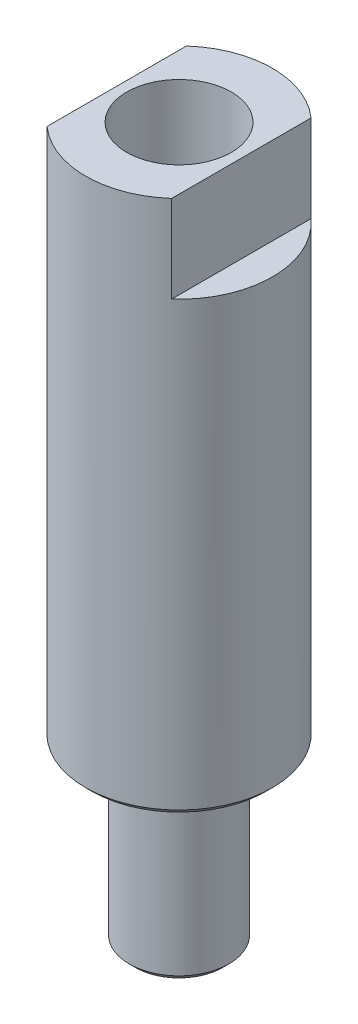
ISO-10303-21;
HEADER;
FILE_DESCRIPTION(('STEP AP214'),'2;1');
FILE_NAME('part.step','',(''),(''),'','','');
FILE_SCHEMA(('AUTOMOTIVE_DESIGN { 1 0 10303 214 1 1 1 1 }'));
ENDSEC;
DATA;
#1=APPLICATION_CONTEXT('core data for automotive mechanical design processes');
#2=APPLICATION_PROTOCOL_DEFINITION('international standard','automotive_design',2000,#1);
#3=PRODUCT_CONTEXT('',#1,'mechanical');
#4=PRODUCT('Part','Part','',(#3));
#5=PRODUCT_RELATED_PRODUCT_CATEGORY('part','',(#4));
#6=PRODUCT_DEFINITION_FORMATION('','',#4);
#7=PRODUCT_DEFINITION_CONTEXT('part definition',#1,'design');
#8=PRODUCT_DEFINITION('design','',#6,#7);
#9=PRODUCT_DEFINITION_SHAPE('','',#8);
#10=(LENGTH_UNIT() NAMED_UNIT(*) SI_UNIT(.MILLI.,.METRE.));
#11=(NAMED_UNIT(*) PLANE_ANGLE_UNIT() SI_UNIT($,.RADIAN.));
#12=(NAMED_UNIT(*) SI_UNIT($,.STERADIAN.) SOLID_ANGLE_UNIT());
#13=UNCERTAINTY_MEASURE_WITH_UNIT(LENGTH_MEASURE(1.E-05),#10,'distance_accuracy_value','');
#14=(GEOMETRIC_REPRESENTATION_CONTEXT(3) GLOBAL_UNCERTAINTY_ASSIGNED_CONTEXT((#13)) GLOBAL_UNIT_ASSIGNED_CONTEXT((#10,
#11,#12)) REPRESENTATION_CONTEXT('',''));
#15=CARTESIAN_POINT('',(0.,0.,0.));
#16=DIRECTION('',(0.,0.,1.));
#17=DIRECTION('',(1.,0.,0.));
#18=AXIS2_PLACEMENT_3D('',#15,#16,#17);
#19=CARTESIAN_POINT('',(0.,43.,0.));
#20=DIRECTION('',(0.,1.,0.));
#21=DIRECTION('',(0.,0.,1.));
#22=AXIS2_PLACEMENT_3D('',#19,#20,#21);
#23=PLANE('',#22);
#24=DIRECTION('',(0.,0.,-1.));
#25=VECTOR('',#24,1.);
#26=CARTESIAN_POINT('',(-5.,43.,0.));
#27=LINE('',#26,#25);
#28=CARTESIAN_POINT('',(-5.,43.,5.59016994374947));
#29=VERTEX_POINT('',#28);
#30=CARTESIAN_POINT('',(-5.,43.,-5.59016994374947));
#31=VERTEX_POINT('',#30);
#32=EDGE_CURVE('E92',#29,#31,#27,.T.);
#33=ORIENTED_EDGE('',*,*,#32,.F.);
#34=CARTESIAN_POINT('',(0.,43.,0.));
#35=DIRECTION('',(0.,1.,0.));
#36=DIRECTION('',(0.,0.,1.));
#37=AXIS2_PLACEMENT_3D('',#34,#35,#36);
#38=CIRCLE('',#37,7.5);
#39=CARTESIAN_POINT('',(5.,43.,5.59016994374947));
#40=VERTEX_POINT('',#39);
#41=EDGE_CURVE('E117',#29,#40,#38,.T.);
#42=ORIENTED_EDGE('',*,*,#41,.T.);
#43=DIRECTION('',(0.,0.,-1.));
#44=VECTOR('',#43,1.);
#45=CARTESIAN_POINT('',(5.,43.,0.));
#46=LINE('',#45,#44);
#47=CARTESIAN_POINT('',(5.,43.,-5.59016994374947));
#48=VERTEX_POINT('',#47);
#49=EDGE_CURVE('E107',#40,#48,#46,.T.);
#50=ORIENTED_EDGE('',*,*,#49,.T.);
#51=EDGE_CURVE('E120',#48,#31,#38,.T.);
#52=ORIENTED_EDGE('',*,*,#51,.T.);
#53=EDGE_LOOP('',(#33,#42,#50,#52));
#54=FACE_BOUND('',#53,.T.);
#55=CARTESIAN_POINT('',(0.,43.,0.));
#56=DIRECTION('',(0.,-1.,0.));
#57=DIRECTION('',(0.,0.,-1.));
#58=AXIS2_PLACEMENT_3D('',#55,#56,#57);
#59=CIRCLE('',#58,4.2);
#60=CARTESIAN_POINT('',(0.,43.,-4.2));
#61=VERTEX_POINT('',#60);
#62=EDGE_CURVE('E93',#61,#61,#59,.T.);
#63=ORIENTED_EDGE('',*,*,#62,.T.);
#64=EDGE_LOOP('',(#63));
#65=FACE_BOUND('',#64,.T.);
#66=ADVANCED_FACE('F38',(#54,#65),#23,.T.);
#67=CARTESIAN_POINT('',(0.,43.,0.));
#68=DIRECTION('',(0.,-1.,0.));
#69=DIRECTION('',(0.,0.,-1.));
#70=AXIS2_PLACEMENT_3D('',#67,#68,#69);
#71=CYLINDRICAL_SURFACE('',#70,7.5);
#72=CARTESIAN_POINT('',(0.,0.5,0.));
#73=DIRECTION('',(0.,1.,0.));
#74=DIRECTION('',(0.,0.,1.));
#75=AXIS2_PLACEMENT_3D('',#72,#73,#74);
#76=CIRCLE('',#75,7.5);
#77=CARTESIAN_POINT('',(0.,0.5,7.5));
#78=VERTEX_POINT('',#77);
#79=EDGE_CURVE('E46',#78,#78,#76,.T.);
#80=ORIENTED_EDGE('',*,*,#79,.T.);
#81=EDGE_LOOP('',(#80));
#82=FACE_BOUND('',#81,.T.);
#83=ORIENTED_EDGE('',*,*,#41,.F.);
#84=DIRECTION('',(0.,1.,0.));
#85=VECTOR('',#84,1.);
#86=CARTESIAN_POINT('',(-5.,36.,5.59016994374947));
#87=LINE('',#86,#85);
#88=CARTESIAN_POINT('',(-5.,36.,5.59016994374947));
#89=VERTEX_POINT('',#88);
#90=EDGE_CURVE('E53',#89,#29,#87,.T.);
#91=ORIENTED_EDGE('',*,*,#90,.F.);
#92=CARTESIAN_POINT('',(0.,36.,0.));
#93=DIRECTION('',(0.,1.,0.));
#94=DIRECTION('',(0.,0.,1.));
#95=AXIS2_PLACEMENT_3D('',#92,#93,#94);
#96=CIRCLE('',#95,7.5);
#97=CARTESIAN_POINT('',(-5.,36.,-5.59016994374947));
#98=VERTEX_POINT('',#97);
#99=EDGE_CURVE('E95',#98,#89,#96,.T.);
#100=ORIENTED_EDGE('',*,*,#99,.F.);
#101=DIRECTION('',(0.,1.,0.));
#102=VECTOR('',#101,1.);
#103=CARTESIAN_POINT('',(-5.,36.,-5.59016994374947));
#104=LINE('',#103,#102);
#105=EDGE_CURVE('E104',#98,#31,#104,.T.);
#106=ORIENTED_EDGE('',*,*,#105,.T.);
#107=ORIENTED_EDGE('',*,*,#51,.F.);
#108=DIRECTION('',(0.,1.,0.));
#109=VECTOR('',#108,1.);
#110=CARTESIAN_POINT('',(5.,36.,-5.59016994374947));
#111=LINE('',#110,#109);
#112=CARTESIAN_POINT('',(5.,36.,-5.59016994374947));
#113=VERTEX_POINT('',#112);
#114=EDGE_CURVE('E61',#113,#48,#111,.T.);
#115=ORIENTED_EDGE('',*,*,#114,.F.);
#116=CARTESIAN_POINT('',(0.,36.,0.));
#117=DIRECTION('',(0.,1.,0.));
#118=DIRECTION('',(0.,0.,1.));
#119=AXIS2_PLACEMENT_3D('',#116,#117,#118);
#120=CIRCLE('',#119,7.5);
#121=CARTESIAN_POINT('',(5.,36.,5.59016994374947));
#122=VERTEX_POINT('',#121);
#123=EDGE_CURVE('E112',#122,#113,#120,.T.);
#124=ORIENTED_EDGE('',*,*,#123,.F.);
#125=DIRECTION('',(0.,1.,0.));
#126=VECTOR('',#125,1.);
#127=CARTESIAN_POINT('',(5.,36.,5.59016994374947));
#128=LINE('',#127,#126);
#129=EDGE_CURVE('E115',#122,#40,#128,.T.);
#130=ORIENTED_EDGE('',*,*,#129,.T.);
#131=EDGE_LOOP('',(#83,#91,#100,#106,#107,#115,#124,#130));
#132=FACE_BOUND('',#131,.T.);
#133=ADVANCED_FACE('F40',(#82,#132),#71,.T.);
#134=CARTESIAN_POINT('',(0.,0.,0.));
#135=DIRECTION('',(0.,1.,0.));
#136=DIRECTION('',(0.,0.,1.));
#137=AXIS2_PLACEMENT_3D('',#134,#135,#136);
#138=PLANE('',#137);
#139=CARTESIAN_POINT('',(0.,0.,0.));
#140=DIRECTION('',(0.,1.,0.));
#141=DIRECTION('',(0.,0.,1.));
#142=AXIS2_PLACEMENT_3D('',#139,#140,#141);
#143=CIRCLE('',#142,6.99999999999999);
#144=CARTESIAN_POINT('',(0.,0.,6.99999999999999));
#145=VERTEX_POINT('',#144);
#146=EDGE_CURVE('E11',#145,#145,#143,.F.);
#147=ORIENTED_EDGE('',*,*,#146,.T.);
#148=EDGE_LOOP('',(#147));
#149=FACE_BOUND('',#148,.T.);
#150=CARTESIAN_POINT('',(0.,0.,0.));
#151=DIRECTION('',(0.,1.,0.));
#152=DIRECTION('',(0.,0.,1.));
#153=AXIS2_PLACEMENT_3D('',#150,#151,#152);
#154=CIRCLE('',#153,4.);
#155=CARTESIAN_POINT('',(0.,0.,4.));
#156=VERTEX_POINT('',#155);
#157=EDGE_CURVE('E123',#156,#156,#154,.F.);
#158=ORIENTED_EDGE('',*,*,#157,.F.);
#159=EDGE_LOOP('',(#158));
#160=FACE_BOUND('',#159,.T.);
#161=ADVANCED_FACE('F152',(#149,#160),#138,.F.);
#162=CARTESIAN_POINT('',(0.,-14.,0.));
#163=DIRECTION('',(0.,1.,0.));
#164=DIRECTION('',(0.,0.,1.));
#165=AXIS2_PLACEMENT_3D('',#162,#163,#164);
#166=CYLINDRICAL_SURFACE('',#165,4.);
#167=CARTESIAN_POINT('',(0.,-13.5,0.));
#168=DIRECTION('',(0.,-1.,0.));
#169=DIRECTION('',(0.,0.,-1.));
#170=AXIS2_PLACEMENT_3D('',#167,#168,#169);
#171=CIRCLE('',#170,4.);
#172=CARTESIAN_POINT('',(0.,-13.5,-4.));
#173=VERTEX_POINT('',#172);
#174=EDGE_CURVE('E129',#173,#173,#171,.F.);
#175=ORIENTED_EDGE('',*,*,#174,.T.);
#176=EDGE_LOOP('',(#175));
#177=FACE_BOUND('',#176,.T.);
#178=ORIENTED_EDGE('',*,*,#157,.T.);
#179=EDGE_LOOP('',(#178));
#180=FACE_BOUND('',#179,.T.);
#181=ADVANCED_FACE('F157',(#177,#180),#166,.T.);
#182=CARTESIAN_POINT('',(0.,-14.,0.));
#183=DIRECTION('',(0.,-1.,0.));
#184=DIRECTION('',(0.,0.,-1.));
#185=AXIS2_PLACEMENT_3D('',#182,#183,#184);
#186=PLANE('',#185);
#187=CARTESIAN_POINT('',(0.,-14.,0.));
#188=DIRECTION('',(0.,-1.,0.));
#189=DIRECTION('',(0.,0.,-1.));
#190=AXIS2_PLACEMENT_3D('',#187,#188,#189);
#191=CIRCLE('',#190,3.49999999999999);
#192=CARTESIAN_POINT('',(0.,-14.,-3.49999999999999));
#193=VERTEX_POINT('',#192);
#194=EDGE_CURVE('E126',#193,#193,#191,.T.);
#195=ORIENTED_EDGE('',*,*,#194,.T.);
#196=EDGE_LOOP('',(#195));
#197=FACE_BOUND('',#196,.T.);
#198=ADVANCED_FACE('F161',(#197),#186,.T.);
#199=CARTESIAN_POINT('',(5.,36.,0.));
#200=DIRECTION('',(1.,0.,0.));
#201=DIRECTION('',(0.,0.,-1.));
#202=AXIS2_PLACEMENT_3D('',#199,#200,#201);
#203=PLANE('',#202);
#204=ORIENTED_EDGE('',*,*,#49,.F.);
#205=ORIENTED_EDGE('',*,*,#129,.F.);
#206=DIRECTION('',(0.,0.,-1.));
#207=VECTOR('',#206,1.);
#208=CARTESIAN_POINT('',(5.,36.,0.));
#209=LINE('',#208,#207);
#210=EDGE_CURVE('E110',#122,#113,#209,.T.);
#211=ORIENTED_EDGE('',*,*,#210,.T.);
#212=ORIENTED_EDGE('',*,*,#114,.T.);
#213=EDGE_LOOP('',(#204,#205,#211,#212));
#214=FACE_BOUND('',#213,.T.);
#215=ADVANCED_FACE('F165',(#214),#203,.T.);
#216=CARTESIAN_POINT('',(-16.6414213562373,36.,0.));
#217=DIRECTION('',(0.,1.,0.));
#218=DIRECTION('',(0.,0.,1.));
#219=AXIS2_PLACEMENT_3D('',#216,#217,#218);
#220=PLANE('',#219);
#221=ORIENTED_EDGE('',*,*,#210,.F.);
#222=ORIENTED_EDGE('',*,*,#123,.T.);
#223=EDGE_LOOP('',(#221,#222));
#224=FACE_BOUND('',#223,.T.);
#225=ADVANCED_FACE('F169',(#224),#220,.T.);
#226=CARTESIAN_POINT('',(-5.,36.,0.));
#227=DIRECTION('',(1.,0.,0.));
#228=DIRECTION('',(0.,0.,-1.));
#229=AXIS2_PLACEMENT_3D('',#226,#227,#228);
#230=PLANE('',#229);
#231=ORIENTED_EDGE('',*,*,#32,.T.);
#232=ORIENTED_EDGE('',*,*,#105,.F.);
#233=DIRECTION('',(0.,0.,-1.));
#234=VECTOR('',#233,1.);
#235=CARTESIAN_POINT('',(-5.,36.,0.));
#236=LINE('',#235,#234);
#237=EDGE_CURVE('E101',#89,#98,#236,.T.);
#238=ORIENTED_EDGE('',*,*,#237,.F.);
#239=ORIENTED_EDGE('',*,*,#90,.T.);
#240=EDGE_LOOP('',(#231,#232,#238,#239));
#241=FACE_BOUND('',#240,.T.);
#242=ADVANCED_FACE('F172',(#241),#230,.F.);
#243=CARTESIAN_POINT('',(-16.6414213562373,36.,0.));
#244=DIRECTION('',(0.,1.,0.));
#245=DIRECTION('',(0.,0.,1.));
#246=AXIS2_PLACEMENT_3D('',#243,#244,#245);
#247=PLANE('',#246);
#248=ORIENTED_EDGE('',*,*,#99,.T.);
#249=ORIENTED_EDGE('',*,*,#237,.T.);
#250=EDGE_LOOP('',(#248,#249));
#251=FACE_BOUND('',#250,.T.);
#252=ADVANCED_FACE('F143',(#251),#247,.T.);
#253=CARTESIAN_POINT('',(0.,-14.,0.));
#254=DIRECTION('',(0.,1.,0.));
#255=DIRECTION('',(0.,0.,1.));
#256=AXIS2_PLACEMENT_3D('',#253,#254,#255);
#257=CONICAL_SURFACE('',#256,3.49999999999999,0.785398163397441);
#258=ORIENTED_EDGE('',*,*,#174,.F.);
#259=EDGE_LOOP('',(#258));
#260=FACE_BOUND('',#259,.T.);
#261=ORIENTED_EDGE('',*,*,#194,.F.);
#262=EDGE_LOOP('',(#261));
#263=FACE_BOUND('',#262,.T.);
#264=ADVANCED_FACE('F137',(#260,#263),#257,.T.);
#265=CARTESIAN_POINT('',(0.,0.5,0.));
#266=DIRECTION('',(0.,1.,0.));
#267=DIRECTION('',(0.,0.,1.));
#268=AXIS2_PLACEMENT_3D('',#265,#266,#267);
#269=CONICAL_SURFACE('',#268,7.5,0.785398163397454);
#270=ORIENTED_EDGE('',*,*,#146,.F.);
#271=EDGE_LOOP('',(#270));
#272=FACE_BOUND('',#271,.T.);
#273=ORIENTED_EDGE('',*,*,#79,.F.);
#274=EDGE_LOOP('',(#273));
#275=FACE_BOUND('',#274,.T.);
#276=ADVANCED_FACE('F86',(#272,#275),#269,.T.);
#277=CARTESIAN_POINT('',(0.,25.,0.));
#278=DIRECTION('',(0.,1.,0.));
#279=DIRECTION('',(0.,0.,1.));
#280=AXIS2_PLACEMENT_3D('',#277,#278,#279);
#281=CONICAL_SURFACE('',#280,4.2,1.02974425867665);
#282=CARTESIAN_POINT('',(0.,22.4763854000842,0.));
#283=VERTEX_POINT('',#282);
#284=VERTEX_LOOP('',#283);
#285=FACE_BOUND('',#284,.T.);
#286=CARTESIAN_POINT('',(0.,25.,0.));
#287=DIRECTION('',(0.,-1.,0.));
#288=DIRECTION('',(0.,0.,-1.));
#289=AXIS2_PLACEMENT_3D('',#286,#287,#288);
#290=CIRCLE('',#289,4.2);
#291=CARTESIAN_POINT('',(0.,25.,-4.2));
#292=VERTEX_POINT('',#291);
#293=EDGE_CURVE('E90',#292,#292,#290,.T.);
#294=ORIENTED_EDGE('',*,*,#293,.F.);
#295=EDGE_LOOP('',(#294));
#296=FACE_BOUND('',#295,.T.);
#297=ADVANCED_FACE('F82',(#285,#296),#281,.F.);
#298=CARTESIAN_POINT('',(0.,0.,0.));
#299=DIRECTION('',(0.,-1.,0.));
#300=DIRECTION('',(0.,0.,-1.));
#301=AXIS2_PLACEMENT_3D('',#298,#299,#300);
#302=CYLINDRICAL_SURFACE('',#301,4.2);
#303=ORIENTED_EDGE('',*,*,#293,.T.);
#304=EDGE_LOOP('',(#303));
#305=FACE_BOUND('',#304,.T.);
#306=ORIENTED_EDGE('',*,*,#62,.F.);
#307=EDGE_LOOP('',(#306));
#308=FACE_BOUND('',#307,.T.);
#309=ADVANCED_FACE('F85',(#305,#308),#302,.F.);
#310=CLOSED_SHELL('',(#66,#133,#161,#181,#198,#215,#225,#242,#252,#264,#276,#297,#309));
#311=MANIFOLD_SOLID_BREP('B2',#310);
#312=ADVANCED_BREP_SHAPE_REPRESENTATION('',(#18,#311),#14);
#313=SHAPE_DEFINITION_REPRESENTATION(#9,#312);
ENDSEC;
END-ISO-10303-21;
